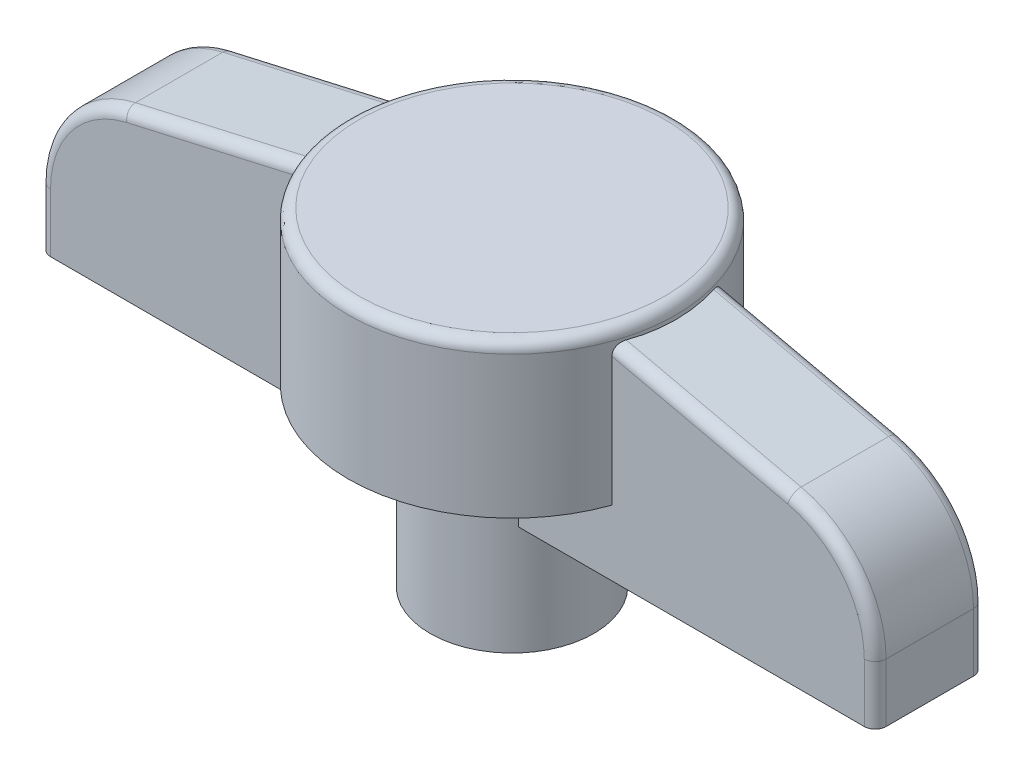
ISO-10303-21;
HEADER;
FILE_DESCRIPTION(('STEP AP214'),'2;1');
FILE_NAME('part.step','',(''),(''),'','','');
FILE_SCHEMA(('AUTOMOTIVE_DESIGN { 1 0 10303 214 1 1 1 1 }'));
ENDSEC;
DATA;
#1=APPLICATION_CONTEXT('core data for automotive mechanical design processes');
#2=APPLICATION_PROTOCOL_DEFINITION('international standard','automotive_design',2000,#1);
#3=PRODUCT_CONTEXT('',#1,'mechanical');
#4=PRODUCT('Part','Part','',(#3));
#5=PRODUCT_RELATED_PRODUCT_CATEGORY('part','',(#4));
#6=PRODUCT_DEFINITION_FORMATION('','',#4);
#7=PRODUCT_DEFINITION_CONTEXT('part definition',#1,'design');
#8=PRODUCT_DEFINITION('design','',#6,#7);
#9=PRODUCT_DEFINITION_SHAPE('','',#8);
#10=(LENGTH_UNIT() NAMED_UNIT(*) SI_UNIT(.MILLI.,.METRE.));
#11=(NAMED_UNIT(*) PLANE_ANGLE_UNIT() SI_UNIT($,.RADIAN.));
#12=(NAMED_UNIT(*) SI_UNIT($,.STERADIAN.) SOLID_ANGLE_UNIT());
#13=UNCERTAINTY_MEASURE_WITH_UNIT(LENGTH_MEASURE(1.E-05),#10,'distance_accuracy_value','');
#14=(GEOMETRIC_REPRESENTATION_CONTEXT(3) GLOBAL_UNCERTAINTY_ASSIGNED_CONTEXT((#13)) GLOBAL_UNIT_ASSIGNED_CONTEXT((#10,
#11,#12)) REPRESENTATION_CONTEXT('',''));
#15=CARTESIAN_POINT('',(0.,0.,0.));
#16=DIRECTION('',(0.,0.,1.));
#17=DIRECTION('',(1.,0.,0.));
#18=AXIS2_PLACEMENT_3D('',#15,#16,#17);
#19=CARTESIAN_POINT('',(0.,-10.,5.));
#20=DIRECTION('',(0.,1.,0.));
#21=DIRECTION('',(0.,0.,1.));
#22=AXIS2_PLACEMENT_3D('',#19,#20,#21);
#23=CYLINDRICAL_SURFACE('',#22,7.5);
#24=CARTESIAN_POINT('',(0.,-10.,5.));
#25=DIRECTION('',(0.,1.,0.));
#26=DIRECTION('',(0.,0.,1.));
#27=AXIS2_PLACEMENT_3D('',#24,#25,#26);
#28=CIRCLE('',#27,7.5);
#29=CARTESIAN_POINT('',(0.,-10.,12.5));
#30=VERTEX_POINT('',#29);
#31=EDGE_CURVE('E392',#30,#30,#28,.T.);
#32=ORIENTED_EDGE('',*,*,#31,.T.);
#33=EDGE_LOOP('',(#32));
#34=FACE_BOUND('',#33,.T.);
#35=DIRECTION('',(0.,1.,0.));
#36=VECTOR('',#35,1.);
#37=CARTESIAN_POINT('',(-5.59016994374947,-10.,0.));
#38=LINE('',#37,#36);
#39=CARTESIAN_POINT('',(-5.59016994374947,6.,0.));
#40=VERTEX_POINT('',#39);
#41=CARTESIAN_POINT('',(-5.59016994374947,0.,0.));
#42=VERTEX_POINT('',#41);
#43=EDGE_CURVE('E440',#40,#42,#38,.F.);
#44=ORIENTED_EDGE('',*,*,#43,.F.);
#45=CARTESIAN_POINT('',(0.,6.,5.));
#46=DIRECTION('',(0.,1.,0.));
#47=DIRECTION('',(0.,0.,1.));
#48=AXIS2_PLACEMENT_3D('',#45,#46,#47);
#49=CIRCLE('',#48,7.5);
#50=CARTESIAN_POINT('',(5.59016994374947,6.,0.));
#51=VERTEX_POINT('',#50);
#52=EDGE_CURVE('E229',#40,#51,#49,.F.);
#53=ORIENTED_EDGE('',*,*,#52,.T.);
#54=DIRECTION('',(0.,1.,0.));
#55=VECTOR('',#54,1.);
#56=CARTESIAN_POINT('',(5.59016994374947,-10.,0.));
#57=LINE('',#56,#55);
#58=CARTESIAN_POINT('',(5.59016994374947,0.,0.));
#59=VERTEX_POINT('',#58);
#60=EDGE_CURVE('E443',#59,#51,#57,.T.);
#61=ORIENTED_EDGE('',*,*,#60,.F.);
#62=CARTESIAN_POINT('',(0.,0.,5.));
#63=DIRECTION('',(0.,-1.,0.));
#64=DIRECTION('',(0.,0.,-1.));
#65=AXIS2_PLACEMENT_3D('',#62,#63,#64);
#66=CIRCLE('',#65,7.5);
#67=CARTESIAN_POINT('',(5.59016994374947,0.,10.));
#68=VERTEX_POINT('',#67);
#69=EDGE_CURVE('E401',#59,#68,#66,.T.);
#70=ORIENTED_EDGE('',*,*,#69,.T.);
#71=DIRECTION('',(0.,1.,0.));
#72=VECTOR('',#71,1.);
#73=CARTESIAN_POINT('',(5.59016994374947,-10.,10.));
#74=LINE('',#73,#72);
#75=CARTESIAN_POINT('',(5.59016994374947,6.,10.));
#76=VERTEX_POINT('',#75);
#77=EDGE_CURVE('E404',#68,#76,#74,.T.);
#78=ORIENTED_EDGE('',*,*,#77,.T.);
#79=CARTESIAN_POINT('',(-5.59016994374947,6.,10.));
#80=VERTEX_POINT('',#79);
#81=EDGE_CURVE('E224',#76,#80,#49,.F.);
#82=ORIENTED_EDGE('',*,*,#81,.T.);
#83=DIRECTION('',(0.,1.,0.));
#84=VECTOR('',#83,1.);
#85=CARTESIAN_POINT('',(-5.59016994374947,-10.,10.));
#86=LINE('',#85,#84);
#87=CARTESIAN_POINT('',(-5.59016994374947,0.,10.));
#88=VERTEX_POINT('',#87);
#89=EDGE_CURVE('E400',#80,#88,#86,.F.);
#90=ORIENTED_EDGE('',*,*,#89,.T.);
#91=EDGE_CURVE('E395',#88,#42,#66,.T.);
#92=ORIENTED_EDGE('',*,*,#91,.T.);
#93=EDGE_LOOP('',(#44,#53,#61,#70,#78,#82,#90,#92));
#94=FACE_BOUND('',#93,.T.);
#95=ADVANCED_FACE('F41',(#34,#94),#23,.T.);
#96=CARTESIAN_POINT('',(0.,0.,10.));
#97=DIRECTION('',(0.,-1.,0.));
#98=DIRECTION('',(0.,0.,-1.));
#99=AXIS2_PLACEMENT_3D('',#96,#97,#98);
#100=PLANE('',#99);
#101=DIRECTION('',(0.,0.,-1.));
#102=VECTOR('',#101,1.);
#103=CARTESIAN_POINT('',(38.25,0.,10.));
#104=LINE('',#103,#102);
#105=CARTESIAN_POINT('',(38.25,0.,9.));
#106=VERTEX_POINT('',#105);
#107=CARTESIAN_POINT('',(38.25,0.,0.999999999999999));
#108=VERTEX_POINT('',#107);
#109=EDGE_CURVE('E428',#106,#108,#104,.T.);
#110=ORIENTED_EDGE('',*,*,#109,.F.);
#111=CARTESIAN_POINT('',(37.25,0.,9.));
#112=DIRECTION('',(0.,-1.,0.));
#113=DIRECTION('',(0.,0.,-1.));
#114=AXIS2_PLACEMENT_3D('',#111,#112,#113);
#115=CIRCLE('',#114,1.);
#116=CARTESIAN_POINT('',(37.25,0.,10.));
#117=VERTEX_POINT('',#116);
#118=EDGE_CURVE('E466',#106,#117,#115,.T.);
#119=ORIENTED_EDGE('',*,*,#118,.T.);
#120=DIRECTION('',(-1.,0.,0.));
#121=VECTOR('',#120,1.);
#122=CARTESIAN_POINT('',(0.,0.,10.));
#123=LINE('',#122,#121);
#124=EDGE_CURVE('E409',#117,#68,#123,.T.);
#125=ORIENTED_EDGE('',*,*,#124,.T.);
#126=ORIENTED_EDGE('',*,*,#69,.F.);
#127=DIRECTION('',(-1.,0.,0.));
#128=VECTOR('',#127,1.);
#129=CARTESIAN_POINT('',(0.,0.,0.));
#130=LINE('',#129,#128);
#131=CARTESIAN_POINT('',(37.25,0.,0.));
#132=VERTEX_POINT('',#131);
#133=EDGE_CURVE('E414',#132,#59,#130,.T.);
#134=ORIENTED_EDGE('',*,*,#133,.F.);
#135=CARTESIAN_POINT('',(37.25,0.,0.999999999999999));
#136=DIRECTION('',(0.,-1.,0.));
#137=DIRECTION('',(0.,0.,-1.));
#138=AXIS2_PLACEMENT_3D('',#135,#136,#137);
#139=CIRCLE('',#138,1.);
#140=EDGE_CURVE('E463',#132,#108,#139,.T.);
#141=ORIENTED_EDGE('',*,*,#140,.T.);
#142=EDGE_LOOP('',(#110,#119,#125,#126,#134,#141));
#143=FACE_BOUND('',#142,.T.);
#144=ADVANCED_FACE('F309',(#143),#100,.T.);
#145=CARTESIAN_POINT('',(0.,0.,10.));
#146=DIRECTION('',(0.,0.,1.));
#147=DIRECTION('',(1.,0.,0.));
#148=AXIS2_PLACEMENT_3D('',#145,#146,#147);
#149=PLANE('',#148);
#150=DIRECTION('',(0.,1.,0.));
#151=VECTOR('',#150,1.);
#152=CARTESIAN_POINT('',(14.142135623731,6.,10.));
#153=LINE('',#152,#151);
#154=CARTESIAN_POINT('',(14.142135623731,6.,10.));
#155=VERTEX_POINT('',#154);
#156=CARTESIAN_POINT('',(14.142135623731,17.8024538168224,10.));
#157=VERTEX_POINT('',#156);
#158=EDGE_CURVE('E57',#155,#157,#153,.T.);
#159=ORIENTED_EDGE('',*,*,#158,.F.);
#160=DIRECTION('',(-1.,0.,0.));
#161=VECTOR('',#160,1.);
#162=CARTESIAN_POINT('',(0.,6.,10.));
#163=LINE('',#162,#161);
#164=EDGE_CURVE('E382',#155,#76,#163,.T.);
#165=ORIENTED_EDGE('',*,*,#164,.T.);
#166=ORIENTED_EDGE('',*,*,#77,.F.);
#167=ORIENTED_EDGE('',*,*,#124,.F.);
#168=DIRECTION('',(0.,1.,0.));
#169=VECTOR('',#168,1.);
#170=CARTESIAN_POINT('',(37.25,5.3564681401711,10.));
#171=LINE('',#170,#169);
#172=CARTESIAN_POINT('',(37.25,5.3564681401711,10.));
#173=VERTEX_POINT('',#172);
#174=EDGE_CURVE('E452',#117,#173,#171,.T.);
#175=ORIENTED_EDGE('',*,*,#174,.T.);
#176=CARTESIAN_POINT('',(28.25,5.35646814017115,10.));
#177=DIRECTION('',(0.,0.,1.));
#178=DIRECTION('',(1.,0.,0.));
#179=AXIS2_PLACEMENT_3D('',#176,#177,#178);
#180=CIRCLE('',#179,9.);
#181=CARTESIAN_POINT('',(30.249843743896,14.1314681401712,10.));
#182=VERTEX_POINT('',#181);
#183=EDGE_CURVE('E449',#173,#182,#180,.T.);
#184=ORIENTED_EDGE('',*,*,#183,.T.);
#185=DIRECTION('',(-0.975,0.22220486043289,0.));
#186=VECTOR('',#185,1.);
#187=CARTESIAN_POINT('',(8.77779513956711,19.025,10.));
#188=LINE('',#187,#186);
#189=EDGE_CURVE('E446',#182,#157,#188,.T.);
#190=ORIENTED_EDGE('',*,*,#189,.T.);
#191=EDGE_LOOP('',(#159,#165,#166,#167,#175,#184,#190));
#192=FACE_BOUND('',#191,.T.);
#193=ADVANCED_FACE('F314',(#192),#149,.T.);
#194=CARTESIAN_POINT('',(0.,0.,0.));
#195=DIRECTION('',(0.,0.,1.));
#196=DIRECTION('',(1.,0.,0.));
#197=AXIS2_PLACEMENT_3D('',#194,#195,#196);
#198=PLANE('',#197);
#199=DIRECTION('',(-1.,0.,0.));
#200=VECTOR('',#199,1.);
#201=CARTESIAN_POINT('',(0.,6.,0.));
#202=LINE('',#201,#200);
#203=CARTESIAN_POINT('',(14.142135623731,6.,0.));
#204=VERTEX_POINT('',#203);
#205=EDGE_CURVE('E65',#204,#51,#202,.T.);
#206=ORIENTED_EDGE('',*,*,#205,.F.);
#207=DIRECTION('',(0.,1.,0.));
#208=VECTOR('',#207,1.);
#209=CARTESIAN_POINT('',(14.142135623731,6.,0.));
#210=LINE('',#209,#208);
#211=CARTESIAN_POINT('',(14.1421356237309,17.8024538168224,0.));
#212=VERTEX_POINT('',#211);
#213=EDGE_CURVE('E377',#204,#212,#210,.T.);
#214=ORIENTED_EDGE('',*,*,#213,.T.);
#215=DIRECTION('',(-0.975,0.22220486043289,0.));
#216=VECTOR('',#215,1.);
#217=CARTESIAN_POINT('',(4.55516491800846,19.9873476502986,0.));
#218=LINE('',#217,#216);
#219=CARTESIAN_POINT('',(30.249843743896,14.1314681401712,0.));
#220=VERTEX_POINT('',#219);
#221=EDGE_CURVE('E475',#212,#220,#218,.F.);
#222=ORIENTED_EDGE('',*,*,#221,.T.);
#223=CARTESIAN_POINT('',(28.25,5.35646814017115,0.));
#224=DIRECTION('',(0.,0.,1.));
#225=DIRECTION('',(1.,0.,0.));
#226=AXIS2_PLACEMENT_3D('',#223,#224,#225);
#227=CIRCLE('',#226,9.);
#228=CARTESIAN_POINT('',(37.25,5.3564681401711,0.));
#229=VERTEX_POINT('',#228);
#230=EDGE_CURVE('E478',#220,#229,#227,.F.);
#231=ORIENTED_EDGE('',*,*,#230,.T.);
#232=DIRECTION('',(0.,1.,0.));
#233=VECTOR('',#232,1.);
#234=CARTESIAN_POINT('',(37.25,0.,0.));
#235=LINE('',#234,#233);
#236=EDGE_CURVE('E481',#229,#132,#235,.F.);
#237=ORIENTED_EDGE('',*,*,#236,.T.);
#238=ORIENTED_EDGE('',*,*,#133,.T.);
#239=ORIENTED_EDGE('',*,*,#60,.T.);
#240=EDGE_LOOP('',(#206,#214,#222,#231,#237,#238,#239));
#241=FACE_BOUND('',#240,.T.);
#242=ADVANCED_FACE('F328',(#241),#198,.F.);
#243=CARTESIAN_POINT('',(-28.25,5.35646814017115,10.));
#244=DIRECTION('',(0.,0.,-1.));
#245=DIRECTION('',(-1.,0.,0.));
#246=AXIS2_PLACEMENT_3D('',#243,#244,#245);
#247=CYLINDRICAL_SURFACE('',#246,10.);
#248=DIRECTION('',(0.,0.,-1.));
#249=VECTOR('',#248,1.);
#250=CARTESIAN_POINT('',(-30.4720486043288,15.1064681401712,10.));
#251=LINE('',#250,#249);
#252=CARTESIAN_POINT('',(-30.4720486043288,15.1064681401712,9.));
#253=VERTEX_POINT('',#252);
#254=CARTESIAN_POINT('',(-30.4720486043288,15.1064681401712,0.999999999999999));
#255=VERTEX_POINT('',#254);
#256=EDGE_CURVE('E412',#253,#255,#251,.T.);
#257=ORIENTED_EDGE('',*,*,#256,.T.);
#258=CARTESIAN_POINT('',(-28.25,5.35646814017115,0.999999999999999));
#259=DIRECTION('',(0.,0.,1.));
#260=DIRECTION('',(1.,0.,0.));
#261=AXIS2_PLACEMENT_3D('',#258,#259,#260);
#262=CIRCLE('',#261,10.);
#263=CARTESIAN_POINT('',(-38.25,5.3564681401711,0.999999999999999));
#264=VERTEX_POINT('',#263);
#265=EDGE_CURVE('E511',#255,#264,#262,.T.);
#266=ORIENTED_EDGE('',*,*,#265,.T.);
#267=DIRECTION('',(0.,0.,-1.));
#268=VECTOR('',#267,1.);
#269=CARTESIAN_POINT('',(-38.25,5.3564681401711,10.));
#270=LINE('',#269,#268);
#271=CARTESIAN_POINT('',(-38.25,5.3564681401711,9.));
#272=VERTEX_POINT('',#271);
#273=EDGE_CURVE('E436',#272,#264,#270,.T.);
#274=ORIENTED_EDGE('',*,*,#273,.F.);
#275=CARTESIAN_POINT('',(-28.25,5.35646814017115,9.));
#276=DIRECTION('',(0.,0.,1.));
#277=DIRECTION('',(1.,0.,0.));
#278=AXIS2_PLACEMENT_3D('',#275,#276,#277);
#279=CIRCLE('',#278,10.);
#280=EDGE_CURVE('E508',#272,#253,#279,.F.);
#281=ORIENTED_EDGE('',*,*,#280,.T.);
#282=EDGE_LOOP('',(#257,#266,#274,#281));
#283=FACE_BOUND('',#282,.T.);
#284=ADVANCED_FACE('F353',(#283),#247,.T.);
#285=CARTESIAN_POINT('',(-38.25,0.,10.));
#286=DIRECTION('',(-1.,0.,0.));
#287=DIRECTION('',(0.,0.,1.));
#288=AXIS2_PLACEMENT_3D('',#285,#286,#287);
#289=PLANE('',#288);
#290=ORIENTED_EDGE('',*,*,#273,.T.);
#291=DIRECTION('',(0.,1.,0.));
#292=VECTOR('',#291,1.);
#293=CARTESIAN_POINT('',(-38.25,0.,1.));
#294=LINE('',#293,#292);
#295=CARTESIAN_POINT('',(-38.25,0.,0.999999999999999));
#296=VERTEX_POINT('',#295);
#297=EDGE_CURVE('E499',#264,#296,#294,.F.);
#298=ORIENTED_EDGE('',*,*,#297,.T.);
#299=DIRECTION('',(0.,0.,-1.));
#300=VECTOR('',#299,1.);
#301=CARTESIAN_POINT('',(-38.25,0.,10.));
#302=LINE('',#301,#300);
#303=CARTESIAN_POINT('',(-38.25,0.,9.));
#304=VERTEX_POINT('',#303);
#305=EDGE_CURVE('E432',#304,#296,#302,.T.);
#306=ORIENTED_EDGE('',*,*,#305,.F.);
#307=DIRECTION('',(0.,1.,0.));
#308=VECTOR('',#307,1.);
#309=CARTESIAN_POINT('',(-38.25,0.,9.));
#310=LINE('',#309,#308);
#311=EDGE_CURVE('E495',#304,#272,#310,.T.);
#312=ORIENTED_EDGE('',*,*,#311,.T.);
#313=EDGE_LOOP('',(#290,#298,#306,#312));
#314=FACE_BOUND('',#313,.T.);
#315=ADVANCED_FACE('F349',(#314),#289,.T.);
#316=ORIENTED_EDGE('',*,*,#305,.T.);
#317=CARTESIAN_POINT('',(-37.25,0.,1.));
#318=DIRECTION('',(0.,-1.,0.));
#319=DIRECTION('',(0.,0.,-1.));
#320=AXIS2_PLACEMENT_3D('',#317,#318,#319);
#321=CIRCLE('',#320,1.);
#322=CARTESIAN_POINT('',(-37.25,0.,0.));
#323=VERTEX_POINT('',#322);
#324=EDGE_CURVE('E505',#296,#323,#321,.T.);
#325=ORIENTED_EDGE('',*,*,#324,.T.);
#326=EDGE_CURVE('E408',#42,#323,#130,.T.);
#327=ORIENTED_EDGE('',*,*,#326,.F.);
#328=ORIENTED_EDGE('',*,*,#91,.F.);
#329=CARTESIAN_POINT('',(-37.25,0.,10.));
#330=VERTEX_POINT('',#329);
#331=EDGE_CURVE('E413',#88,#330,#123,.T.);
#332=ORIENTED_EDGE('',*,*,#331,.T.);
#333=CARTESIAN_POINT('',(-37.25,0.,9.));
#334=DIRECTION('',(0.,-1.,0.));
#335=DIRECTION('',(0.,0.,-1.));
#336=AXIS2_PLACEMENT_3D('',#333,#334,#335);
#337=CIRCLE('',#336,1.);
#338=EDGE_CURVE('E502',#330,#304,#337,.T.);
#339=ORIENTED_EDGE('',*,*,#338,.T.);
#340=EDGE_LOOP('',(#316,#325,#327,#328,#332,#339));
#341=FACE_BOUND('',#340,.T.);
#342=ADVANCED_FACE('F317',(#341),#100,.T.);
#343=CARTESIAN_POINT('',(38.25,0.,10.));
#344=DIRECTION('',(-1.,0.,0.));
#345=DIRECTION('',(0.,0.,1.));
#346=AXIS2_PLACEMENT_3D('',#343,#344,#345);
#347=PLANE('',#346);
#348=DIRECTION('',(0.,0.,-1.));
#349=VECTOR('',#348,1.);
#350=CARTESIAN_POINT('',(38.25,5.3564681401711,10.));
#351=LINE('',#350,#349);
#352=CARTESIAN_POINT('',(38.25,5.3564681401711,9.));
#353=VERTEX_POINT('',#352);
#354=CARTESIAN_POINT('',(38.25,5.3564681401711,0.999999999999999));
#355=VERTEX_POINT('',#354);
#356=EDGE_CURVE('E424',#353,#355,#351,.T.);
#357=ORIENTED_EDGE('',*,*,#356,.F.);
#358=DIRECTION('',(0.,1.,0.));
#359=VECTOR('',#358,1.);
#360=CARTESIAN_POINT('',(38.25,0.,9.));
#361=LINE('',#360,#359);
#362=EDGE_CURVE('E460',#353,#106,#361,.F.);
#363=ORIENTED_EDGE('',*,*,#362,.T.);
#364=ORIENTED_EDGE('',*,*,#109,.T.);
#365=DIRECTION('',(0.,1.,0.));
#366=VECTOR('',#365,1.);
#367=CARTESIAN_POINT('',(38.25,0.,0.999999999999999));
#368=LINE('',#367,#366);
#369=EDGE_CURVE('E456',#108,#355,#368,.T.);
#370=ORIENTED_EDGE('',*,*,#369,.T.);
#371=EDGE_LOOP('',(#357,#363,#364,#370));
#372=FACE_BOUND('',#371,.T.);
#373=ADVANCED_FACE('F343',(#372),#347,.F.);
#374=CARTESIAN_POINT('',(28.25,5.35646814017115,10.));
#375=DIRECTION('',(0.,0.,-1.));
#376=DIRECTION('',(-1.,0.,0.));
#377=AXIS2_PLACEMENT_3D('',#374,#375,#376);
#378=CYLINDRICAL_SURFACE('',#377,10.);
#379=DIRECTION('',(0.,0.,-1.));
#380=VECTOR('',#379,1.);
#381=CARTESIAN_POINT('',(30.4720486043288,15.1064681401712,10.));
#382=LINE('',#381,#380);
#383=CARTESIAN_POINT('',(30.4720486043288,15.1064681401712,9.));
#384=VERTEX_POINT('',#383);
#385=CARTESIAN_POINT('',(30.4720486043288,15.1064681401712,0.999999999999999));
#386=VERTEX_POINT('',#385);
#387=EDGE_CURVE('E420',#384,#386,#382,.T.);
#388=ORIENTED_EDGE('',*,*,#387,.F.);
#389=CARTESIAN_POINT('',(28.25,5.35646814017115,9.));
#390=DIRECTION('',(0.,0.,1.));
#391=DIRECTION('',(1.,0.,0.));
#392=AXIS2_PLACEMENT_3D('',#389,#390,#391);
#393=CIRCLE('',#392,10.);
#394=EDGE_CURVE('E472',#384,#353,#393,.F.);
#395=ORIENTED_EDGE('',*,*,#394,.T.);
#396=ORIENTED_EDGE('',*,*,#356,.T.);
#397=CARTESIAN_POINT('',(28.25,5.35646814017115,0.999999999999999));
#398=DIRECTION('',(0.,0.,1.));
#399=DIRECTION('',(1.,0.,0.));
#400=AXIS2_PLACEMENT_3D('',#397,#398,#399);
#401=CIRCLE('',#400,10.);
#402=EDGE_CURVE('E469',#355,#386,#401,.T.);
#403=ORIENTED_EDGE('',*,*,#402,.T.);
#404=EDGE_LOOP('',(#388,#395,#396,#403));
#405=FACE_BOUND('',#404,.T.);
#406=ADVANCED_FACE('F339',(#405),#378,.T.);
#407=CARTESIAN_POINT('',(4.77736977844135,20.9623476502986,10.));
#408=DIRECTION('',(-0.22220486043289,-0.975,0.));
#409=DIRECTION('',(0.975,-0.22220486043289,0.));
#410=AXIS2_PLACEMENT_3D('',#407,#408,#409);
#411=PLANE('',#410);
#412=DIRECTION('',(-0.975,0.22220486043289,0.));
#413=VECTOR('',#412,1.);
#414=CARTESIAN_POINT('',(4.77736977844135,20.9623476502986,0.999999999999999));
#415=LINE('',#414,#413);
#416=CARTESIAN_POINT('',(14.456832294801,18.7563747092596,0.999999999999999));
#417=VERTEX_POINT('',#416);
#418=EDGE_CURVE('E231',#386,#417,#415,.T.);
#419=ORIENTED_EDGE('',*,*,#418,.T.);
#420=CARTESIAN_POINT('',(0.,22.0511217886113,5.));
#421=DIRECTION('',(-0.22220486043289,-0.975,0.));
#422=DIRECTION('',(-0.975,0.22220486043289,0.));
#423=AXIS2_PLACEMENT_3D('',#420,#421,#422);
#424=ELLIPSE('',#423,15.3846153846154,15.);
#425=CARTESIAN_POINT('',(14.456832294801,18.7563747092596,9.));
#426=VERTEX_POINT('',#425);
#427=EDGE_CURVE('E274',#417,#426,#424,.T.);
#428=ORIENTED_EDGE('',*,*,#427,.T.);
#429=DIRECTION('',(-0.975,0.22220486043289,0.));
#430=VECTOR('',#429,1.);
#431=CARTESIAN_POINT('',(30.4720486043288,15.1064681401712,9.));
#432=LINE('',#431,#430);
#433=EDGE_CURVE('E225',#426,#384,#432,.F.);
#434=ORIENTED_EDGE('',*,*,#433,.T.);
#435=ORIENTED_EDGE('',*,*,#387,.T.);
#436=EDGE_LOOP('',(#419,#428,#434,#435));
#437=FACE_BOUND('',#436,.T.);
#438=ADVANCED_FACE('F331',(#437),#411,.F.);
#439=CARTESIAN_POINT('',(-4.77736977844135,20.9623476502986,10.));
#440=DIRECTION('',(-0.22220486043289,0.975,0.));
#441=DIRECTION('',(-0.975,-0.22220486043289,0.));
#442=AXIS2_PLACEMENT_3D('',#439,#440,#441);
#443=PLANE('',#442);
#444=CARTESIAN_POINT('',(0.,22.0511217886113,5.));
#445=DIRECTION('',(-0.22220486043289,0.975,0.));
#446=DIRECTION('',(0.975,0.22220486043289,0.));
#447=AXIS2_PLACEMENT_3D('',#444,#445,#446);
#448=ELLIPSE('',#447,15.3846153846154,15.);
#449=CARTESIAN_POINT('',(-14.456832294801,18.7563747092596,1.));
#450=VERTEX_POINT('',#449);
#451=CARTESIAN_POINT('',(-14.456832294801,18.7563747092596,9.));
#452=VERTEX_POINT('',#451);
#453=EDGE_CURVE('E217',#450,#452,#448,.T.);
#454=ORIENTED_EDGE('',*,*,#453,.F.);
#455=DIRECTION('',(0.975,0.22220486043289,0.));
#456=VECTOR('',#455,1.);
#457=CARTESIAN_POINT('',(-30.4720486043288,15.1064681401712,1.));
#458=LINE('',#457,#456);
#459=EDGE_CURVE('E518',#450,#255,#458,.F.);
#460=ORIENTED_EDGE('',*,*,#459,.T.);
#461=ORIENTED_EDGE('',*,*,#256,.F.);
#462=DIRECTION('',(0.975,0.22220486043289,0.));
#463=VECTOR('',#462,1.);
#464=CARTESIAN_POINT('',(-4.77736977844135,20.9623476502986,9.));
#465=LINE('',#464,#463);
#466=EDGE_CURVE('E521',#253,#452,#465,.T.);
#467=ORIENTED_EDGE('',*,*,#466,.T.);
#468=EDGE_LOOP('',(#454,#460,#461,#467));
#469=FACE_BOUND('',#468,.T.);
#470=ADVANCED_FACE('F324',(#469),#443,.T.);
#471=DIRECTION('',(0.,1.,0.));
#472=VECTOR('',#471,1.);
#473=CARTESIAN_POINT('',(-14.142135623731,6.,10.));
#474=LINE('',#473,#472);
#475=CARTESIAN_POINT('',(-14.1421356237309,17.8024538168224,10.));
#476=VERTEX_POINT('',#475);
#477=CARTESIAN_POINT('',(-14.142135623731,6.,10.));
#478=VERTEX_POINT('',#477);
#479=EDGE_CURVE('E208',#476,#478,#474,.F.);
#480=ORIENTED_EDGE('',*,*,#479,.F.);
#481=DIRECTION('',(0.975,0.22220486043289,0.));
#482=VECTOR('',#481,1.);
#483=CARTESIAN_POINT('',(-4.55516491800846,19.9873476502986,10.));
#484=LINE('',#483,#482);
#485=CARTESIAN_POINT('',(-30.249843743896,14.1314681401712,10.));
#486=VERTEX_POINT('',#485);
#487=EDGE_CURVE('E192',#476,#486,#484,.F.);
#488=ORIENTED_EDGE('',*,*,#487,.T.);
#489=CARTESIAN_POINT('',(-28.25,5.35646814017115,10.));
#490=DIRECTION('',(0.,0.,1.));
#491=DIRECTION('',(1.,0.,0.));
#492=AXIS2_PLACEMENT_3D('',#489,#490,#491);
#493=CIRCLE('',#492,9.);
#494=CARTESIAN_POINT('',(-37.25,5.3564681401711,10.));
#495=VERTEX_POINT('',#494);
#496=EDGE_CURVE('E205',#486,#495,#493,.T.);
#497=ORIENTED_EDGE('',*,*,#496,.T.);
#498=DIRECTION('',(0.,1.,0.));
#499=VECTOR('',#498,1.);
#500=CARTESIAN_POINT('',(-37.25,0.,10.));
#501=LINE('',#500,#499);
#502=EDGE_CURVE('E204',#495,#330,#501,.F.);
#503=ORIENTED_EDGE('',*,*,#502,.T.);
#504=ORIENTED_EDGE('',*,*,#331,.F.);
#505=ORIENTED_EDGE('',*,*,#89,.F.);
#506=DIRECTION('',(-1.,0.,0.));
#507=VECTOR('',#506,1.);
#508=CARTESIAN_POINT('',(0.,6.,10.));
#509=LINE('',#508,#507);
#510=EDGE_CURVE('E212',#80,#478,#509,.T.);
#511=ORIENTED_EDGE('',*,*,#510,.T.);
#512=EDGE_LOOP('',(#480,#488,#497,#503,#504,#505,#511));
#513=FACE_BOUND('',#512,.T.);
#514=ADVANCED_FACE('F209',(#513),#149,.T.);
#515=DIRECTION('',(0.975,0.22220486043289,0.));
#516=VECTOR('',#515,1.);
#517=CARTESIAN_POINT('',(-8.77779513956711,19.025,0.));
#518=LINE('',#517,#516);
#519=CARTESIAN_POINT('',(-30.249843743896,14.1314681401712,0.));
#520=VERTEX_POINT('',#519);
#521=CARTESIAN_POINT('',(-14.142135623731,17.8024538168224,0.));
#522=VERTEX_POINT('',#521);
#523=EDGE_CURVE('E484',#520,#522,#518,.T.);
#524=ORIENTED_EDGE('',*,*,#523,.T.);
#525=DIRECTION('',(0.,1.,0.));
#526=VECTOR('',#525,1.);
#527=CARTESIAN_POINT('',(-14.142135623731,6.,0.));
#528=LINE('',#527,#526);
#529=CARTESIAN_POINT('',(-14.142135623731,6.,0.));
#530=VERTEX_POINT('',#529);
#531=EDGE_CURVE('E275',#522,#530,#528,.F.);
#532=ORIENTED_EDGE('',*,*,#531,.T.);
#533=DIRECTION('',(-1.,0.,0.));
#534=VECTOR('',#533,1.);
#535=CARTESIAN_POINT('',(0.,6.,0.));
#536=LINE('',#535,#534);
#537=EDGE_CURVE('E385',#40,#530,#536,.T.);
#538=ORIENTED_EDGE('',*,*,#537,.F.);
#539=ORIENTED_EDGE('',*,*,#43,.T.);
#540=ORIENTED_EDGE('',*,*,#326,.T.);
#541=DIRECTION('',(0.,1.,0.));
#542=VECTOR('',#541,1.);
#543=CARTESIAN_POINT('',(-37.25,5.3564681401711,0.));
#544=LINE('',#543,#542);
#545=CARTESIAN_POINT('',(-37.25,5.3564681401711,0.));
#546=VERTEX_POINT('',#545);
#547=EDGE_CURVE('E491',#323,#546,#544,.T.);
#548=ORIENTED_EDGE('',*,*,#547,.T.);
#549=CARTESIAN_POINT('',(-28.25,5.35646814017115,0.));
#550=DIRECTION('',(0.,0.,1.));
#551=DIRECTION('',(1.,0.,0.));
#552=AXIS2_PLACEMENT_3D('',#549,#550,#551);
#553=CIRCLE('',#552,9.);
#554=EDGE_CURVE('E488',#546,#520,#553,.F.);
#555=ORIENTED_EDGE('',*,*,#554,.T.);
#556=EDGE_LOOP('',(#524,#532,#538,#539,#540,#548,#555));
#557=FACE_BOUND('',#556,.T.);
#558=ADVANCED_FACE('F323',(#557),#198,.F.);
#559=CARTESIAN_POINT('',(0.,-10.,5.));
#560=DIRECTION('',(0.,1.,0.));
#561=DIRECTION('',(0.,0.,1.));
#562=AXIS2_PLACEMENT_3D('',#559,#560,#561);
#563=PLANE('',#562);
#564=ORIENTED_EDGE('',*,*,#31,.F.);
#565=EDGE_LOOP('',(#564));
#566=FACE_BOUND('',#565,.T.);
#567=ADVANCED_FACE('F249',(#566),#563,.F.);
#568=CARTESIAN_POINT('',(4.55516491800846,19.9873476502986,9.));
#569=DIRECTION('',(0.975,-0.22220486043289,0.));
#570=DIRECTION('',(0.22220486043289,0.975,0.));
#571=AXIS2_PLACEMENT_3D('',#568,#569,#570);
#572=CYLINDRICAL_SURFACE('',#571,1.);
#573=CARTESIAN_POINT('',(14.1421356237309,17.8024538168224,10.));
#574=CARTESIAN_POINT('',(14.1421352227468,17.8291560373133,9.9999999759888));
#575=CARTESIAN_POINT('',(14.1424954257486,17.8558483494301,9.99898246325084));
#576=CARTESIAN_POINT('',(14.1439427232462,17.9090596142695,9.99488649961511));
#577=CARTESIAN_POINT('',(14.1450299693162,17.9355785296779,9.99180761896241));
#578=CARTESIAN_POINT('',(14.1493879645635,18.0145806544332,9.97944800647708));
#579=CARTESIAN_POINT('',(14.1537549510682,18.0665578209069,9.96704439331582));
#580=CARTESIAN_POINT('',(14.1652988302115,18.1675859342002,9.93402589835691));
#581=CARTESIAN_POINT('',(14.1724805122192,18.2166317283084,9.91339701974576));
#582=CARTESIAN_POINT('',(14.1893576090857,18.310215265777,9.8644421272932));
#583=CARTESIAN_POINT('',(14.1990514504286,18.3547558068541,9.83612093107929));
#584=CARTESIAN_POINT('',(14.2203020699797,18.4371913493103,9.77326750584108));
#585=CARTESIAN_POINT('',(14.231816323127,18.4752044217407,9.73887535623453));
#586=CARTESIAN_POINT('',(14.2563621900407,18.5447276138856,9.66451153365949));
#587=CARTESIAN_POINT('',(14.2693940703229,18.576236588691,9.62453888043356));
#588=CARTESIAN_POINT('',(14.2966899132761,18.6325270343775,9.5394584054688));
#589=CARTESIAN_POINT('',(14.3109708883097,18.6571866734502,9.49427563538083));
#590=CARTESIAN_POINT('',(14.3400615139557,18.6986411701453,9.40057356484939));
#591=CARTESIAN_POINT('',(14.35487146175,18.7154315294897,9.3520523742083));
#592=CARTESIAN_POINT('',(14.3844410667149,18.7408379135564,9.2532899066533));
#593=CARTESIAN_POINT('',(14.3992004059518,18.7495074157196,9.20306217259469));
#594=CARTESIAN_POINT('',(14.4283688014047,18.7588873364977,9.10183116948587));
#595=CARTESIAN_POINT('',(14.4427782567338,18.7596072942049,9.05082890348188));
#596=CARTESIAN_POINT('',(14.456832294801,18.7563747092596,9.));
#597=B_SPLINE_CURVE_WITH_KNOTS('',3,(#573,#574,#575,#576,#577,#578,#579,#580,#581,#582,#583,
#584,#585,#586,#587,#588,#589,#590,#591,#592,#593,#594,#595,#596),.UNSPECIFIED.,.F.,.F.,(4,2,2,
2,2,2,2,2,2,2,2,4),(0.,0.0800634272059235,0.160143551271391,0.320159856576563,0.480449629402684,
0.640639244785267,0.797526484279545,0.954441316953448,1.11399063898692,1.27363105252315,
1.43221265552876,1.59060394710896),.UNSPECIFIED.);
#598=EDGE_CURVE('E369',#157,#426,#597,.T.);
#599=ORIENTED_EDGE('',*,*,#598,.F.);
#600=ORIENTED_EDGE('',*,*,#189,.F.);
#601=CARTESIAN_POINT('',(30.249843743896,14.1314681401712,9.));
#602=DIRECTION('',(0.975,-0.222204860432888,0.));
#603=DIRECTION('',(0.222204860432888,0.975,0.));
#604=AXIS2_PLACEMENT_3D('',#601,#602,#603);
#605=CIRCLE('',#604,1.);
#606=EDGE_CURVE('E396',#384,#182,#605,.T.);
#607=ORIENTED_EDGE('',*,*,#606,.F.);
#608=ORIENTED_EDGE('',*,*,#433,.F.);
#609=EDGE_LOOP('',(#599,#600,#607,#608));
#610=FACE_BOUND('',#609,.T.);
#611=ADVANCED_FACE('F364',(#610),#572,.T.);
#612=CARTESIAN_POINT('',(28.25,5.35646814017115,9.));
#613=DIRECTION('',(0.,0.,1.));
#614=DIRECTION('',(1.,0.,0.));
#615=AXIS2_PLACEMENT_3D('',#612,#613,#614);
#616=TOROIDAL_SURFACE('',#615,9.,1.);
#617=ORIENTED_EDGE('',*,*,#606,.T.);
#618=ORIENTED_EDGE('',*,*,#183,.F.);
#619=CARTESIAN_POINT('',(37.25,5.3564681401711,9.));
#620=DIRECTION('',(0.,-1.,0.));
#621=DIRECTION('',(0.,0.,-1.));
#622=AXIS2_PLACEMENT_3D('',#619,#620,#621);
#623=CIRCLE('',#622,1.);
#624=EDGE_CURVE('E527',#353,#173,#623,.T.);
#625=ORIENTED_EDGE('',*,*,#624,.F.);
#626=ORIENTED_EDGE('',*,*,#394,.F.);
#627=EDGE_LOOP('',(#617,#618,#625,#626));
#628=FACE_BOUND('',#627,.T.);
#629=ADVANCED_FACE('F360',(#628),#616,.T.);
#630=CARTESIAN_POINT('',(37.25,0.,9.));
#631=DIRECTION('',(0.,-1.,0.));
#632=DIRECTION('',(0.,0.,-1.));
#633=AXIS2_PLACEMENT_3D('',#630,#631,#632);
#634=CYLINDRICAL_SURFACE('',#633,1.);
#635=ORIENTED_EDGE('',*,*,#118,.F.);
#636=ORIENTED_EDGE('',*,*,#362,.F.);
#637=ORIENTED_EDGE('',*,*,#624,.T.);
#638=ORIENTED_EDGE('',*,*,#174,.F.);
#639=EDGE_LOOP('',(#635,#636,#637,#638));
#640=FACE_BOUND('',#639,.T.);
#641=ADVANCED_FACE('F283',(#640),#634,.T.);
#642=CARTESIAN_POINT('',(4.55516491800846,19.9873476502986,0.999999999999999));
#643=DIRECTION('',(-0.975,0.22220486043289,0.));
#644=DIRECTION('',(-0.22220486043289,-0.975,0.));
#645=AXIS2_PLACEMENT_3D('',#642,#643,#644);
#646=CYLINDRICAL_SURFACE('',#645,1.);
#647=CARTESIAN_POINT('',(14.456832294801,18.7563747092596,0.999999999999999));
#648=CARTESIAN_POINT('',(14.4414436328444,18.7599256055643,0.944332002015183));
#649=CARTESIAN_POINT('',(14.4256225849612,18.7587206867737,0.888450958995292));
#650=CARTESIAN_POINT('',(14.3935984884726,18.7467781331005,0.777732605376764));
#651=CARTESIAN_POINT('',(14.3773948531378,18.7360247869301,0.72289716721521));
#652=CARTESIAN_POINT('',(14.3451145657227,18.7049256218282,0.615841216086144));
#653=CARTESIAN_POINT('',(14.3290381816528,18.6845632488015,0.563625388502989));
#654=CARTESIAN_POINT('',(14.2976866952947,18.6345943183954,0.463603420526957));
#655=CARTESIAN_POINT('',(14.2824108390727,18.6049966484077,0.415793097644939));
#656=CARTESIAN_POINT('',(14.2539213397665,18.538614140793,0.327979332874965));
#657=CARTESIAN_POINT('',(14.2406491701735,18.5021696654399,0.287737832084168));
#658=CARTESIAN_POINT('',(14.2160687708124,18.4223595520118,0.214093711492471));
#659=CARTESIAN_POINT('',(14.2047601083581,18.3789954428268,0.180689584689849));
#660=CARTESIAN_POINT('',(14.1851332814101,18.288885473589,0.123231049237917));
#661=CARTESIAN_POINT('',(14.1766978176916,18.2424010987186,0.0988054283671492));
#662=CARTESIAN_POINT('',(14.1624544743853,18.1457078800025,0.0577984375030204));
#663=CARTESIAN_POINT('',(14.1566465434441,18.0954991089699,0.0412169142019742));
#664=CARTESIAN_POINT('',(14.1488818723837,18.0047362616239,0.0191116401377538));
#665=CARTESIAN_POINT('',(14.1463459212515,17.9646253989596,0.0119197963194382));
#666=CARTESIAN_POINT('',(14.1429702790924,17.883826943057,0.00236095134322047));
#667=CARTESIAN_POINT('',(14.1421278296366,17.8431403965703,-1.38959482089483E-05));
#668=CARTESIAN_POINT('',(14.1421356237309,17.8024538168224,0.));
#669=B_SPLINE_CURVE_WITH_KNOTS('',3,(#647,#648,#649,#650,#651,#652,#653,#654,#655,#656,#657,
#658,#659,#660,#661,#662,#663,#664,#665,#666,#667,#668),.UNSPECIFIED.,.F.,.F.,(4,2,2,2,2,2,2,2,
2,2,4),(0.,0.173449970556201,0.347185871203936,0.521222176796945,0.695091516108969,
0.861905827810567,1.02868333286738,1.18747210093212,1.34625776544746,1.46843137742116,
1.59040582737413),.UNSPECIFIED.);
#670=EDGE_CURVE('E265',#417,#212,#669,.T.);
#671=ORIENTED_EDGE('',*,*,#670,.F.);
#672=ORIENTED_EDGE('',*,*,#418,.F.);
#673=CARTESIAN_POINT('',(30.249843743896,14.1314681401712,1.));
#674=DIRECTION('',(0.975000000000001,-0.222204860432885,0.));
#675=DIRECTION('',(0.222204860432885,0.975000000000001,0.));
#676=AXIS2_PLACEMENT_3D('',#673,#674,#675);
#677=CIRCLE('',#676,1.);
#678=EDGE_CURVE('E530',#220,#386,#677,.T.);
#679=ORIENTED_EDGE('',*,*,#678,.F.);
#680=ORIENTED_EDGE('',*,*,#221,.F.);
#681=EDGE_LOOP('',(#671,#672,#679,#680));
#682=FACE_BOUND('',#681,.T.);
#683=ADVANCED_FACE('F277',(#682),#646,.T.);
#684=CARTESIAN_POINT('',(28.25,5.35646814017115,0.999999999999999));
#685=DIRECTION('',(0.,0.,1.));
#686=DIRECTION('',(1.,0.,0.));
#687=AXIS2_PLACEMENT_3D('',#684,#685,#686);
#688=TOROIDAL_SURFACE('',#687,9.,1.);
#689=ORIENTED_EDGE('',*,*,#678,.T.);
#690=ORIENTED_EDGE('',*,*,#402,.F.);
#691=CARTESIAN_POINT('',(37.25,5.3564681401711,1.));
#692=DIRECTION('',(0.,-1.,0.));
#693=DIRECTION('',(0.,0.,-1.));
#694=AXIS2_PLACEMENT_3D('',#691,#692,#693);
#695=CIRCLE('',#694,1.);
#696=EDGE_CURVE('E534',#229,#355,#695,.T.);
#697=ORIENTED_EDGE('',*,*,#696,.F.);
#698=ORIENTED_EDGE('',*,*,#230,.F.);
#699=EDGE_LOOP('',(#689,#690,#697,#698));
#700=FACE_BOUND('',#699,.T.);
#701=ADVANCED_FACE('F282',(#700),#688,.T.);
#702=CARTESIAN_POINT('',(37.25,0.,0.999999999999999));
#703=DIRECTION('',(0.,1.,0.));
#704=DIRECTION('',(0.,0.,1.));
#705=AXIS2_PLACEMENT_3D('',#702,#703,#704);
#706=CYLINDRICAL_SURFACE('',#705,1.);
#707=ORIENTED_EDGE('',*,*,#140,.F.);
#708=ORIENTED_EDGE('',*,*,#236,.F.);
#709=ORIENTED_EDGE('',*,*,#696,.T.);
#710=ORIENTED_EDGE('',*,*,#369,.F.);
#711=EDGE_LOOP('',(#707,#708,#709,#710));
#712=FACE_BOUND('',#711,.T.);
#713=ADVANCED_FACE('F297',(#712),#706,.T.);
#714=CARTESIAN_POINT('',(-4.55516491800846,19.9873476502986,1.));
#715=DIRECTION('',(-0.975,-0.22220486043289,0.));
#716=DIRECTION('',(0.22220486043289,-0.975,0.));
#717=AXIS2_PLACEMENT_3D('',#714,#715,#716);
#718=CYLINDRICAL_SURFACE('',#717,1.);
#719=CARTESIAN_POINT('',(-14.1421356237309,17.8024538168224,0.));
#720=CARTESIAN_POINT('',(-14.1421352227468,17.8291560373133,2.40112050770491E-08));
#721=CARTESIAN_POINT('',(-14.1424954257486,17.8558483494301,0.00101753674916253));
#722=CARTESIAN_POINT('',(-14.1439427232462,17.9090596142695,0.00511350038489551));
#723=CARTESIAN_POINT('',(-14.1450299693162,17.9355785296779,0.0081923810375933));
#724=CARTESIAN_POINT('',(-14.1493879645635,18.0145806544332,0.0205519935229214));
#725=CARTESIAN_POINT('',(-14.1537549510682,18.0665578209069,0.0329556066841789));
#726=CARTESIAN_POINT('',(-14.1652988302115,18.1675859342002,0.0659741016430882));
#727=CARTESIAN_POINT('',(-14.1724805122192,18.2166317283084,0.0866029802542391));
#728=CARTESIAN_POINT('',(-14.1893576090857,18.310215265777,0.135557872706797));
#729=CARTESIAN_POINT('',(-14.1990514504286,18.3547558068541,0.163879068920707));
#730=CARTESIAN_POINT('',(-14.2203020699797,18.4371913493103,0.226732494158923));
#731=CARTESIAN_POINT('',(-14.231816323127,18.4752044217407,0.261124643765472));
#732=CARTESIAN_POINT('',(-14.2563621900407,18.5447276138856,0.335488466340514));
#733=CARTESIAN_POINT('',(-14.2693940703229,18.576236588691,0.375461119566444));
#734=CARTESIAN_POINT('',(-14.2966899132761,18.6325270343775,0.460541594531204));
#735=CARTESIAN_POINT('',(-14.3109708883097,18.6571866734502,0.505724364619172));
#736=CARTESIAN_POINT('',(-14.3400615139557,18.6986411701453,0.599426435150609));
#737=CARTESIAN_POINT('',(-14.35487146175,18.7154315294897,0.647947625791701));
#738=CARTESIAN_POINT('',(-14.3844410667149,18.7408379135564,0.746710093346702));
#739=CARTESIAN_POINT('',(-14.3992004059518,18.7495074157196,0.79693782740531));
#740=CARTESIAN_POINT('',(-14.4283688014047,18.7588873364977,0.898168830514132));
#741=CARTESIAN_POINT('',(-14.4427782567338,18.7596072942049,0.949171096518124));
#742=CARTESIAN_POINT('',(-14.456832294801,18.7563747092596,1.));
#743=B_SPLINE_CURVE_WITH_KNOTS('',3,(#719,#720,#721,#722,#723,#724,#725,#726,#727,#728,#729,
#730,#731,#732,#733,#734,#735,#736,#737,#738,#739,#740,#741,#742),.UNSPECIFIED.,.F.,.F.,(4,2,2,
2,2,2,2,2,2,2,2,4),(0.,0.080063427205927,0.160143551271391,0.320159856576562,0.48044962940268,
0.640639244785267,0.797526484279545,0.954441316953448,1.11399063898691,1.27363105252315,
1.43221265552876,1.59060394710896),.UNSPECIFIED.);
#744=EDGE_CURVE('E256',#522,#450,#743,.T.);
#745=ORIENTED_EDGE('',*,*,#744,.F.);
#746=ORIENTED_EDGE('',*,*,#523,.F.);
#747=CARTESIAN_POINT('',(-30.249843743896,14.1314681401712,1.));
#748=DIRECTION('',(-0.975,-0.222204860432888,0.));
#749=DIRECTION('',(0.222204860432888,-0.975,0.));
#750=AXIS2_PLACEMENT_3D('',#747,#748,#749);
#751=CIRCLE('',#750,1.);
#752=EDGE_CURVE('E537',#255,#520,#751,.T.);
#753=ORIENTED_EDGE('',*,*,#752,.F.);
#754=ORIENTED_EDGE('',*,*,#459,.F.);
#755=EDGE_LOOP('',(#745,#746,#753,#754));
#756=FACE_BOUND('',#755,.T.);
#757=ADVANCED_FACE('F292',(#756),#718,.T.);
#758=CARTESIAN_POINT('',(-28.25,5.35646814017115,0.999999999999999));
#759=DIRECTION('',(0.,0.,1.));
#760=DIRECTION('',(1.,0.,0.));
#761=AXIS2_PLACEMENT_3D('',#758,#759,#760);
#762=TOROIDAL_SURFACE('',#761,9.,1.);
#763=ORIENTED_EDGE('',*,*,#752,.T.);
#764=ORIENTED_EDGE('',*,*,#554,.F.);
#765=CARTESIAN_POINT('',(-37.25,5.3564681401711,0.999999999999999));
#766=DIRECTION('',(0.,-1.,0.));
#767=DIRECTION('',(1.,0.,0.));
#768=AXIS2_PLACEMENT_3D('',#765,#766,#767);
#769=CIRCLE('',#768,1.);
#770=EDGE_CURVE('E541',#264,#546,#769,.T.);
#771=ORIENTED_EDGE('',*,*,#770,.F.);
#772=ORIENTED_EDGE('',*,*,#265,.F.);
#773=EDGE_LOOP('',(#763,#764,#771,#772));
#774=FACE_BOUND('',#773,.T.);
#775=ADVANCED_FACE('F289',(#774),#762,.T.);
#776=CARTESIAN_POINT('',(-37.25,0.,1.));
#777=DIRECTION('',(0.,-1.,0.));
#778=DIRECTION('',(0.,0.,-1.));
#779=AXIS2_PLACEMENT_3D('',#776,#777,#778);
#780=CYLINDRICAL_SURFACE('',#779,1.);
#781=ORIENTED_EDGE('',*,*,#324,.F.);
#782=ORIENTED_EDGE('',*,*,#297,.F.);
#783=ORIENTED_EDGE('',*,*,#770,.T.);
#784=ORIENTED_EDGE('',*,*,#547,.F.);
#785=EDGE_LOOP('',(#781,#782,#783,#784));
#786=FACE_BOUND('',#785,.T.);
#787=ADVANCED_FACE('F286',(#786),#780,.T.);
#788=CARTESIAN_POINT('',(-4.55516491800846,19.9873476502986,9.));
#789=DIRECTION('',(0.975,0.22220486043289,0.));
#790=DIRECTION('',(-0.22220486043289,0.975,0.));
#791=AXIS2_PLACEMENT_3D('',#788,#789,#790);
#792=CYLINDRICAL_SURFACE('',#791,1.);
#793=CARTESIAN_POINT('',(-14.456832294801,18.7563747092596,9.));
#794=CARTESIAN_POINT('',(-14.4414436328444,18.7599256055643,9.05566799798482));
#795=CARTESIAN_POINT('',(-14.4256225849612,18.7587206867737,9.11154904100471));
#796=CARTESIAN_POINT('',(-14.3935984884726,18.7467781331005,9.22226739462324));
#797=CARTESIAN_POINT('',(-14.3773948531378,18.7360247869301,9.27710283278479));
#798=CARTESIAN_POINT('',(-14.3451145657227,18.7049256218282,9.38415878391386));
#799=CARTESIAN_POINT('',(-14.3290381816528,18.6845632488015,9.43637461149701));
#800=CARTESIAN_POINT('',(-14.2976866952947,18.6345943183954,9.53639657947304));
#801=CARTESIAN_POINT('',(-14.2824108390727,18.6049966484077,9.58420690235506));
#802=CARTESIAN_POINT('',(-14.2539213397665,18.538614140793,9.67202066712504));
#803=CARTESIAN_POINT('',(-14.2406491701735,18.5021696654399,9.71226216791583));
#804=CARTESIAN_POINT('',(-14.2160687708124,18.4223595520118,9.78590628850753));
#805=CARTESIAN_POINT('',(-14.2047601083581,18.3789954428268,9.81931041531015));
#806=CARTESIAN_POINT('',(-14.1851332814101,18.288885473589,9.87676895076208));
#807=CARTESIAN_POINT('',(-14.1766978176916,18.2424010987186,9.90119457163285));
#808=CARTESIAN_POINT('',(-14.1624544743853,18.1457078800025,9.94220156249698));
#809=CARTESIAN_POINT('',(-14.1566465434441,18.0954991089699,9.95878308579803));
#810=CARTESIAN_POINT('',(-14.1488818723837,18.0047362616239,9.98088835986225));
#811=CARTESIAN_POINT('',(-14.1463459212515,17.9646253989596,9.98808020368056));
#812=CARTESIAN_POINT('',(-14.1429702790924,17.883826943057,9.99763904865678));
#813=CARTESIAN_POINT('',(-14.1421278296366,17.8431403965703,10.0000138959482));
#814=CARTESIAN_POINT('',(-14.1421356237309,17.8024538168224,10.));
#815=B_SPLINE_CURVE_WITH_KNOTS('',3,(#793,#794,#795,#796,#797,#798,#799,#800,#801,#802,#803,
#804,#805,#806,#807,#808,#809,#810,#811,#812,#813,#814),.UNSPECIFIED.,.F.,.F.,(4,2,2,2,2,2,2,2,
2,2,4),(0.,0.173449970556202,0.347185871203937,0.521222176796943,0.695091516108969,
0.861905827810566,1.02868333286738,1.18747210093211,1.34625776544746,1.46843137742116,
1.59040582737413),.UNSPECIFIED.);
#816=EDGE_CURVE('E197',#452,#476,#815,.T.);
#817=ORIENTED_EDGE('',*,*,#816,.F.);
#818=ORIENTED_EDGE('',*,*,#466,.F.);
#819=CARTESIAN_POINT('',(-30.249843743896,14.1314681401712,9.));
#820=DIRECTION('',(-0.975,-0.222204860432888,0.));
#821=DIRECTION('',(0.222204860432888,-0.975,0.));
#822=AXIS2_PLACEMENT_3D('',#819,#820,#821);
#823=CIRCLE('',#822,1.);
#824=EDGE_CURVE('E200',#486,#253,#823,.T.);
#825=ORIENTED_EDGE('',*,*,#824,.F.);
#826=ORIENTED_EDGE('',*,*,#487,.F.);
#827=EDGE_LOOP('',(#817,#818,#825,#826));
#828=FACE_BOUND('',#827,.T.);
#829=ADVANCED_FACE('F194',(#828),#792,.T.);
#830=CARTESIAN_POINT('',(-28.25,5.35646814017115,9.));
#831=DIRECTION('',(0.,0.,1.));
#832=DIRECTION('',(1.,0.,0.));
#833=AXIS2_PLACEMENT_3D('',#830,#831,#832);
#834=TOROIDAL_SURFACE('',#833,9.,1.);
#835=ORIENTED_EDGE('',*,*,#824,.T.);
#836=ORIENTED_EDGE('',*,*,#280,.F.);
#837=CARTESIAN_POINT('',(-37.25,5.3564681401711,9.));
#838=DIRECTION('',(0.,-1.,0.));
#839=DIRECTION('',(0.,0.,-1.));
#840=AXIS2_PLACEMENT_3D('',#837,#838,#839);
#841=CIRCLE('',#840,1.);
#842=EDGE_CURVE('E391',#495,#272,#841,.T.);
#843=ORIENTED_EDGE('',*,*,#842,.F.);
#844=ORIENTED_EDGE('',*,*,#496,.F.);
#845=EDGE_LOOP('',(#835,#836,#843,#844));
#846=FACE_BOUND('',#845,.T.);
#847=ADVANCED_FACE('F301',(#846),#834,.T.);
#848=CARTESIAN_POINT('',(-37.25,0.,9.));
#849=DIRECTION('',(0.,1.,0.));
#850=DIRECTION('',(0.,0.,1.));
#851=AXIS2_PLACEMENT_3D('',#848,#849,#850);
#852=CYLINDRICAL_SURFACE('',#851,1.);
#853=ORIENTED_EDGE('',*,*,#338,.F.);
#854=ORIENTED_EDGE('',*,*,#502,.F.);
#855=ORIENTED_EDGE('',*,*,#842,.T.);
#856=ORIENTED_EDGE('',*,*,#311,.F.);
#857=EDGE_LOOP('',(#853,#854,#855,#856));
#858=FACE_BOUND('',#857,.T.);
#859=ADVANCED_FACE('F299',(#858),#852,.T.);
#860=CARTESIAN_POINT('',(0.,6.,5.));
#861=DIRECTION('',(0.,1.,0.));
#862=DIRECTION('',(0.,0.,1.));
#863=AXIS2_PLACEMENT_3D('',#860,#861,#862);
#864=PLANE('',#863);
#865=CARTESIAN_POINT('',(0.,6.,5.));
#866=DIRECTION('',(0.,1.,0.));
#867=DIRECTION('',(0.,0.,1.));
#868=AXIS2_PLACEMENT_3D('',#865,#866,#867);
#869=CIRCLE('',#868,15.);
#870=EDGE_CURVE('E218',#204,#530,#869,.T.);
#871=ORIENTED_EDGE('',*,*,#870,.F.);
#872=ORIENTED_EDGE('',*,*,#205,.T.);
#873=ORIENTED_EDGE('',*,*,#52,.F.);
#874=ORIENTED_EDGE('',*,*,#537,.T.);
#875=EDGE_LOOP('',(#871,#872,#873,#874));
#876=FACE_BOUND('',#875,.T.);
#877=ADVANCED_FACE('F247',(#876),#864,.F.);
#878=CARTESIAN_POINT('',(0.,6.,5.));
#879=DIRECTION('',(0.,1.,0.));
#880=DIRECTION('',(0.,0.,1.));
#881=AXIS2_PLACEMENT_3D('',#878,#879,#880);
#882=CYLINDRICAL_SURFACE('',#881,15.);
#883=CARTESIAN_POINT('',(0.,19.,5.));
#884=DIRECTION('',(0.,1.,0.));
#885=DIRECTION('',(0.,0.,1.));
#886=AXIS2_PLACEMENT_3D('',#883,#884,#885);
#887=CIRCLE('',#886,15.);
#888=CARTESIAN_POINT('',(0.,19.,20.));
#889=VERTEX_POINT('',#888);
#890=EDGE_CURVE('E11',#889,#889,#887,.F.);
#891=ORIENTED_EDGE('',*,*,#890,.T.);
#892=EDGE_LOOP('',(#891));
#893=FACE_BOUND('',#892,.T.);
#894=EDGE_CURVE('E584',#478,#155,#869,.T.);
#895=ORIENTED_EDGE('',*,*,#894,.T.);
#896=ORIENTED_EDGE('',*,*,#158,.T.);
#897=ORIENTED_EDGE('',*,*,#598,.T.);
#898=ORIENTED_EDGE('',*,*,#427,.F.);
#899=ORIENTED_EDGE('',*,*,#670,.T.);
#900=ORIENTED_EDGE('',*,*,#213,.F.);
#901=ORIENTED_EDGE('',*,*,#870,.T.);
#902=ORIENTED_EDGE('',*,*,#531,.F.);
#903=ORIENTED_EDGE('',*,*,#744,.T.);
#904=ORIENTED_EDGE('',*,*,#453,.T.);
#905=ORIENTED_EDGE('',*,*,#816,.T.);
#906=ORIENTED_EDGE('',*,*,#479,.T.);
#907=EDGE_LOOP('',(#895,#896,#897,#898,#899,#900,#901,#902,#903,#904,#905,#906));
#908=FACE_BOUND('',#907,.T.);
#909=ADVANCED_FACE('F221',(#893,#908),#882,.T.);
#910=ORIENTED_EDGE('',*,*,#164,.F.);
#911=ORIENTED_EDGE('',*,*,#894,.F.);
#912=ORIENTED_EDGE('',*,*,#510,.F.);
#913=ORIENTED_EDGE('',*,*,#81,.F.);
#914=EDGE_LOOP('',(#910,#911,#912,#913));
#915=FACE_BOUND('',#914,.T.);
#916=ADVANCED_FACE('F246',(#915),#864,.F.);
#917=CARTESIAN_POINT('',(0.,20.,10.));
#918=DIRECTION('',(0.,1.,0.));
#919=DIRECTION('',(0.,0.,1.));
#920=AXIS2_PLACEMENT_3D('',#917,#918,#919);
#921=PLANE('',#920);
#922=CARTESIAN_POINT('',(0.,20.,5.));
#923=DIRECTION('',(0.,1.,0.));
#924=DIRECTION('',(0.,0.,1.));
#925=AXIS2_PLACEMENT_3D('',#922,#923,#924);
#926=CIRCLE('',#925,14.);
#927=CARTESIAN_POINT('',(0.,20.,19.));
#928=VERTEX_POINT('',#927);
#929=EDGE_CURVE('E50',#928,#928,#926,.T.);
#930=ORIENTED_EDGE('',*,*,#929,.T.);
#931=EDGE_LOOP('',(#930));
#932=FACE_BOUND('',#931,.T.);
#933=ADVANCED_FACE('F333',(#932),#921,.T.);
#934=CARTESIAN_POINT('',(0.,19.,5.));
#935=DIRECTION('',(0.,1.,0.));
#936=DIRECTION('',(0.,0.,1.));
#937=AXIS2_PLACEMENT_3D('',#934,#935,#936);
#938=TOROIDAL_SURFACE('',#937,14.,1.);
#939=ORIENTED_EDGE('',*,*,#890,.F.);
#940=EDGE_LOOP('',(#939));
#941=FACE_BOUND('',#940,.T.);
#942=ORIENTED_EDGE('',*,*,#929,.F.);
#943=EDGE_LOOP('',(#942));
#944=FACE_BOUND('',#943,.T.);
#945=ADVANCED_FACE('F43',(#941,#944),#938,.T.);
#946=CLOSED_SHELL('',(#95,#144,#193,#242,#284,#315,#342,#373,#406,#438,#470,#514,#558,#567,#611,
#629,#641,#683,#701,#713,#757,#775,#787,#829,#847,#859,#877,#909,#916,#933,#945));
#947=MANIFOLD_SOLID_BREP('B2',#946);
#948=ADVANCED_BREP_SHAPE_REPRESENTATION('',(#18,#947),#14);
#949=SHAPE_DEFINITION_REPRESENTATION(#9,#948);
ENDSEC;
END-ISO-10303-21;
